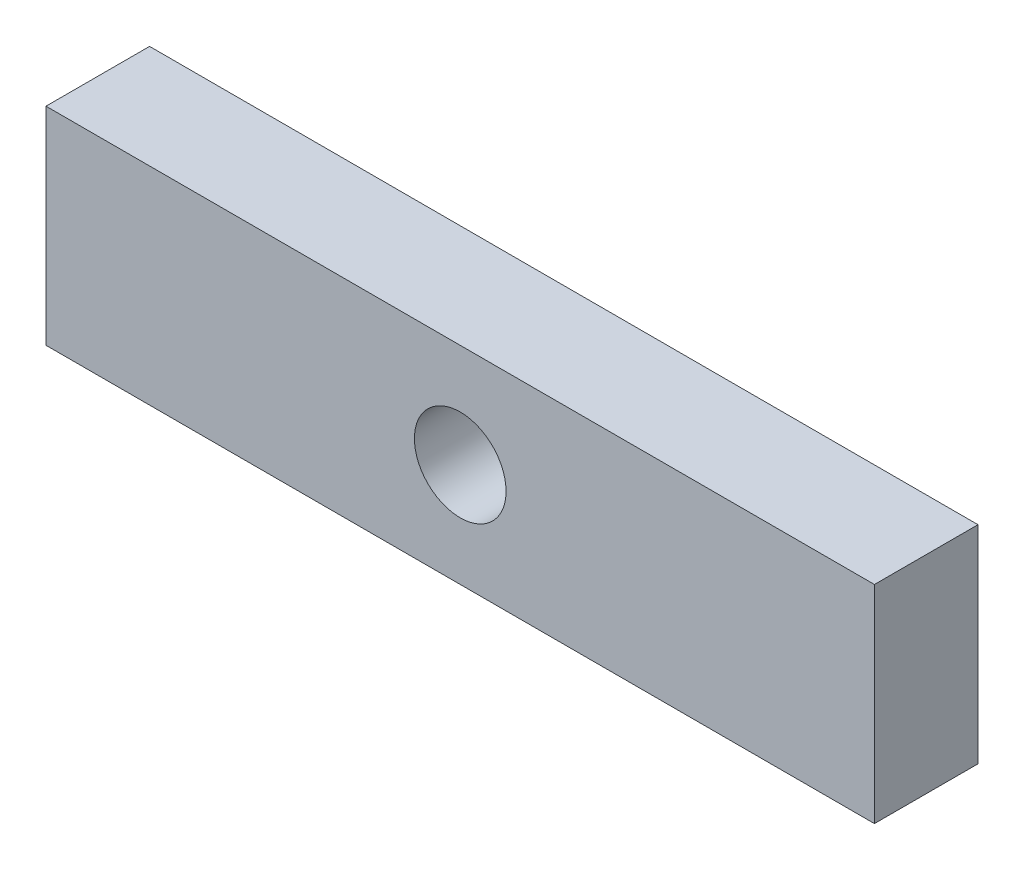
ISO-10303-21;
HEADER;
FILE_DESCRIPTION(('STEP AP214'),'2;1');
FILE_NAME('part.step','',(''),(''),'','','');
FILE_SCHEMA(('AUTOMOTIVE_DESIGN { 1 0 10303 214 1 1 1 1 }'));
ENDSEC;
DATA;
#1=APPLICATION_CONTEXT('core data for automotive mechanical design processes');
#2=APPLICATION_PROTOCOL_DEFINITION('international standard','automotive_design',2000,#1);
#3=PRODUCT_CONTEXT('',#1,'mechanical');
#4=PRODUCT('Part','Part','',(#3));
#5=PRODUCT_RELATED_PRODUCT_CATEGORY('part','',(#4));
#6=PRODUCT_DEFINITION_FORMATION('','',#4);
#7=PRODUCT_DEFINITION_CONTEXT('part definition',#1,'design');
#8=PRODUCT_DEFINITION('design','',#6,#7);
#9=PRODUCT_DEFINITION_SHAPE('','',#8);
#10=(LENGTH_UNIT() NAMED_UNIT(*) SI_UNIT(.MILLI.,.METRE.));
#11=(NAMED_UNIT(*) PLANE_ANGLE_UNIT() SI_UNIT($,.RADIAN.));
#12=(NAMED_UNIT(*) SI_UNIT($,.STERADIAN.) SOLID_ANGLE_UNIT());
#13=UNCERTAINTY_MEASURE_WITH_UNIT(LENGTH_MEASURE(1.E-05),#10,'distance_accuracy_value','');
#14=(GEOMETRIC_REPRESENTATION_CONTEXT(3) GLOBAL_UNCERTAINTY_ASSIGNED_CONTEXT((#13)) GLOBAL_UNIT_ASSIGNED_CONTEXT((#10,
#11,#12)) REPRESENTATION_CONTEXT('',''));
#15=CARTESIAN_POINT('',(0.,0.,0.));
#16=DIRECTION('',(0.,0.,1.));
#17=DIRECTION('',(1.,0.,0.));
#18=AXIS2_PLACEMENT_3D('',#15,#16,#17);
#19=CARTESIAN_POINT('',(38.1,-9.525,9.525));
#20=DIRECTION('',(-1.,0.,0.));
#21=DIRECTION('',(0.,0.,1.));
#22=AXIS2_PLACEMENT_3D('',#19,#20,#21);
#23=PLANE('',#22);
#24=DIRECTION('',(0.,1.,0.));
#25=VECTOR('',#24,1.);
#26=CARTESIAN_POINT('',(38.1,-9.525,0.));
#27=LINE('',#26,#25);
#28=CARTESIAN_POINT('',(38.1,-9.525,0.));
#29=VERTEX_POINT('',#28);
#30=CARTESIAN_POINT('',(38.1,9.525,0.));
#31=VERTEX_POINT('',#30);
#32=EDGE_CURVE('E98',#29,#31,#27,.T.);
#33=ORIENTED_EDGE('',*,*,#32,.T.);
#34=DIRECTION('',(0.,0.,-1.));
#35=VECTOR('',#34,1.);
#36=CARTESIAN_POINT('',(38.1,9.525,9.525));
#37=LINE('',#36,#35);
#38=CARTESIAN_POINT('',(38.1,9.525,9.525));
#39=VERTEX_POINT('',#38);
#40=EDGE_CURVE('E11',#39,#31,#37,.T.);
#41=ORIENTED_EDGE('',*,*,#40,.F.);
#42=DIRECTION('',(0.,1.,0.));
#43=VECTOR('',#42,1.);
#44=CARTESIAN_POINT('',(38.1,-9.525,9.525));
#45=LINE('',#44,#43);
#46=CARTESIAN_POINT('',(38.1,-9.525,9.525));
#47=VERTEX_POINT('',#46);
#48=EDGE_CURVE('E86',#47,#39,#45,.T.);
#49=ORIENTED_EDGE('',*,*,#48,.F.);
#50=DIRECTION('',(0.,0.,-1.));
#51=VECTOR('',#50,1.);
#52=CARTESIAN_POINT('',(38.1,-9.525,9.525));
#53=LINE('',#52,#51);
#54=EDGE_CURVE('E94',#47,#29,#53,.T.);
#55=ORIENTED_EDGE('',*,*,#54,.T.);
#56=EDGE_LOOP('',(#33,#41,#49,#55));
#57=FACE_BOUND('',#56,.T.);
#58=ADVANCED_FACE('F35',(#57),#23,.F.);
#59=CARTESIAN_POINT('',(-38.1,9.525,9.525));
#60=DIRECTION('',(0.,-1.,0.));
#61=DIRECTION('',(0.,0.,-1.));
#62=AXIS2_PLACEMENT_3D('',#59,#60,#61);
#63=PLANE('',#62);
#64=DIRECTION('',(-1.,0.,0.));
#65=VECTOR('',#64,1.);
#66=CARTESIAN_POINT('',(-38.1,9.525,0.));
#67=LINE('',#66,#65);
#68=CARTESIAN_POINT('',(-38.1,9.525,0.));
#69=VERTEX_POINT('',#68);
#70=EDGE_CURVE('E90',#31,#69,#67,.T.);
#71=ORIENTED_EDGE('',*,*,#70,.T.);
#72=DIRECTION('',(0.,0.,-1.));
#73=VECTOR('',#72,1.);
#74=CARTESIAN_POINT('',(-38.1,9.525,9.525));
#75=LINE('',#74,#73);
#76=CARTESIAN_POINT('',(-38.1,9.525,9.525));
#77=VERTEX_POINT('',#76);
#78=EDGE_CURVE('E43',#77,#69,#75,.T.);
#79=ORIENTED_EDGE('',*,*,#78,.F.);
#80=DIRECTION('',(-1.,0.,0.));
#81=VECTOR('',#80,1.);
#82=CARTESIAN_POINT('',(-38.1,9.525,9.525));
#83=LINE('',#82,#81);
#84=EDGE_CURVE('E81',#39,#77,#83,.T.);
#85=ORIENTED_EDGE('',*,*,#84,.F.);
#86=ORIENTED_EDGE('',*,*,#40,.T.);
#87=EDGE_LOOP('',(#71,#79,#85,#86));
#88=FACE_BOUND('',#87,.T.);
#89=ADVANCED_FACE('F89',(#88),#63,.F.);
#90=CARTESIAN_POINT('',(-38.1,-9.525,9.525));
#91=DIRECTION('',(1.,0.,0.));
#92=DIRECTION('',(0.,0.,-1.));
#93=AXIS2_PLACEMENT_3D('',#90,#91,#92);
#94=PLANE('',#93);
#95=DIRECTION('',(0.,-1.,0.));
#96=VECTOR('',#95,1.);
#97=CARTESIAN_POINT('',(-38.1,-9.525,0.));
#98=LINE('',#97,#96);
#99=CARTESIAN_POINT('',(-38.1,-9.525,0.));
#100=VERTEX_POINT('',#99);
#101=EDGE_CURVE('E68',#69,#100,#98,.T.);
#102=ORIENTED_EDGE('',*,*,#101,.T.);
#103=DIRECTION('',(0.,0.,-1.));
#104=VECTOR('',#103,1.);
#105=CARTESIAN_POINT('',(-38.1,-9.525,9.525));
#106=LINE('',#105,#104);
#107=CARTESIAN_POINT('',(-38.1,-9.525,9.525));
#108=VERTEX_POINT('',#107);
#109=EDGE_CURVE('E91',#108,#100,#106,.T.);
#110=ORIENTED_EDGE('',*,*,#109,.F.);
#111=DIRECTION('',(0.,-1.,0.));
#112=VECTOR('',#111,1.);
#113=CARTESIAN_POINT('',(-38.1,-9.525,9.525));
#114=LINE('',#113,#112);
#115=EDGE_CURVE('E84',#77,#108,#114,.T.);
#116=ORIENTED_EDGE('',*,*,#115,.F.);
#117=ORIENTED_EDGE('',*,*,#78,.T.);
#118=EDGE_LOOP('',(#102,#110,#116,#117));
#119=FACE_BOUND('',#118,.T.);
#120=ADVANCED_FACE('F92',(#119),#94,.F.);
#121=CARTESIAN_POINT('',(-38.1,-9.525,9.525));
#122=DIRECTION('',(0.,1.,0.));
#123=DIRECTION('',(0.,0.,1.));
#124=AXIS2_PLACEMENT_3D('',#121,#122,#123);
#125=PLANE('',#124);
#126=DIRECTION('',(1.,0.,0.));
#127=VECTOR('',#126,1.);
#128=CARTESIAN_POINT('',(-38.1,-9.525,0.));
#129=LINE('',#128,#127);
#130=EDGE_CURVE('E74',#100,#29,#129,.T.);
#131=ORIENTED_EDGE('',*,*,#130,.T.);
#132=ORIENTED_EDGE('',*,*,#54,.F.);
#133=DIRECTION('',(1.,0.,0.));
#134=VECTOR('',#133,1.);
#135=CARTESIAN_POINT('',(-38.1,-9.525,9.525));
#136=LINE('',#135,#134);
#137=EDGE_CURVE('E51',#108,#47,#136,.T.);
#138=ORIENTED_EDGE('',*,*,#137,.F.);
#139=ORIENTED_EDGE('',*,*,#109,.T.);
#140=EDGE_LOOP('',(#131,#132,#138,#139));
#141=FACE_BOUND('',#140,.T.);
#142=ADVANCED_FACE('F106',(#141),#125,.F.);
#143=CARTESIAN_POINT('',(0.,0.,9.525));
#144=DIRECTION('',(0.,0.,-1.));
#145=DIRECTION('',(-1.,0.,0.));
#146=AXIS2_PLACEMENT_3D('',#143,#144,#145);
#147=PLANE('',#146);
#148=CARTESIAN_POINT('',(0.,0.,9.525));
#149=DIRECTION('',(0.,0.,1.));
#150=DIRECTION('',(1.,0.,0.));
#151=AXIS2_PLACEMENT_3D('',#148,#149,#150);
#152=CIRCLE('',#151,4.2164);
#153=CARTESIAN_POINT('',(4.2164,0.,9.525));
#154=VERTEX_POINT('',#153);
#155=EDGE_CURVE('E114',#154,#154,#152,.T.);
#156=ORIENTED_EDGE('',*,*,#155,.F.);
#157=EDGE_LOOP('',(#156));
#158=FACE_BOUND('',#157,.T.);
#159=ORIENTED_EDGE('',*,*,#48,.T.);
#160=ORIENTED_EDGE('',*,*,#84,.T.);
#161=ORIENTED_EDGE('',*,*,#115,.T.);
#162=ORIENTED_EDGE('',*,*,#137,.T.);
#163=EDGE_LOOP('',(#159,#160,#161,#162));
#164=FACE_BOUND('',#163,.T.);
#165=ADVANCED_FACE('F82',(#158,#164),#147,.F.);
#166=CARTESIAN_POINT('',(0.,0.,0.));
#167=DIRECTION('',(0.,0.,-1.));
#168=DIRECTION('',(-1.,0.,0.));
#169=AXIS2_PLACEMENT_3D('',#166,#167,#168);
#170=PLANE('',#169);
#171=CARTESIAN_POINT('',(0.,0.,0.));
#172=DIRECTION('',(0.,0.,1.));
#173=DIRECTION('',(1.,0.,0.));
#174=AXIS2_PLACEMENT_3D('',#171,#172,#173);
#175=CIRCLE('',#174,4.2164);
#176=CARTESIAN_POINT('',(4.2164,0.,0.));
#177=VERTEX_POINT('',#176);
#178=EDGE_CURVE('E101',#177,#177,#175,.T.);
#179=ORIENTED_EDGE('',*,*,#178,.T.);
#180=EDGE_LOOP('',(#179));
#181=FACE_BOUND('',#180,.T.);
#182=ORIENTED_EDGE('',*,*,#32,.F.);
#183=ORIENTED_EDGE('',*,*,#130,.F.);
#184=ORIENTED_EDGE('',*,*,#101,.F.);
#185=ORIENTED_EDGE('',*,*,#70,.F.);
#186=EDGE_LOOP('',(#182,#183,#184,#185));
#187=FACE_BOUND('',#186,.T.);
#188=ADVANCED_FACE('F109',(#181,#187),#170,.T.);
#189=CARTESIAN_POINT('',(0.,0.,9.525));
#190=DIRECTION('',(0.,0.,1.));
#191=DIRECTION('',(1.,0.,0.));
#192=AXIS2_PLACEMENT_3D('',#189,#190,#191);
#193=CYLINDRICAL_SURFACE('',#192,4.2164);
#194=ORIENTED_EDGE('',*,*,#178,.F.);
#195=EDGE_LOOP('',(#194));
#196=FACE_BOUND('',#195,.T.);
#197=ORIENTED_EDGE('',*,*,#155,.T.);
#198=EDGE_LOOP('',(#197));
#199=FACE_BOUND('',#198,.T.);
#200=ADVANCED_FACE('F118',(#196,#199),#193,.F.);
#201=CLOSED_SHELL('',(#58,#89,#120,#142,#165,#188,#200));
#202=MANIFOLD_SOLID_BREP('B2',#201);
#203=ADVANCED_BREP_SHAPE_REPRESENTATION('',(#18,#202),#14);
#204=SHAPE_DEFINITION_REPRESENTATION(#9,#203);
ENDSEC;
END-ISO-10303-21;
